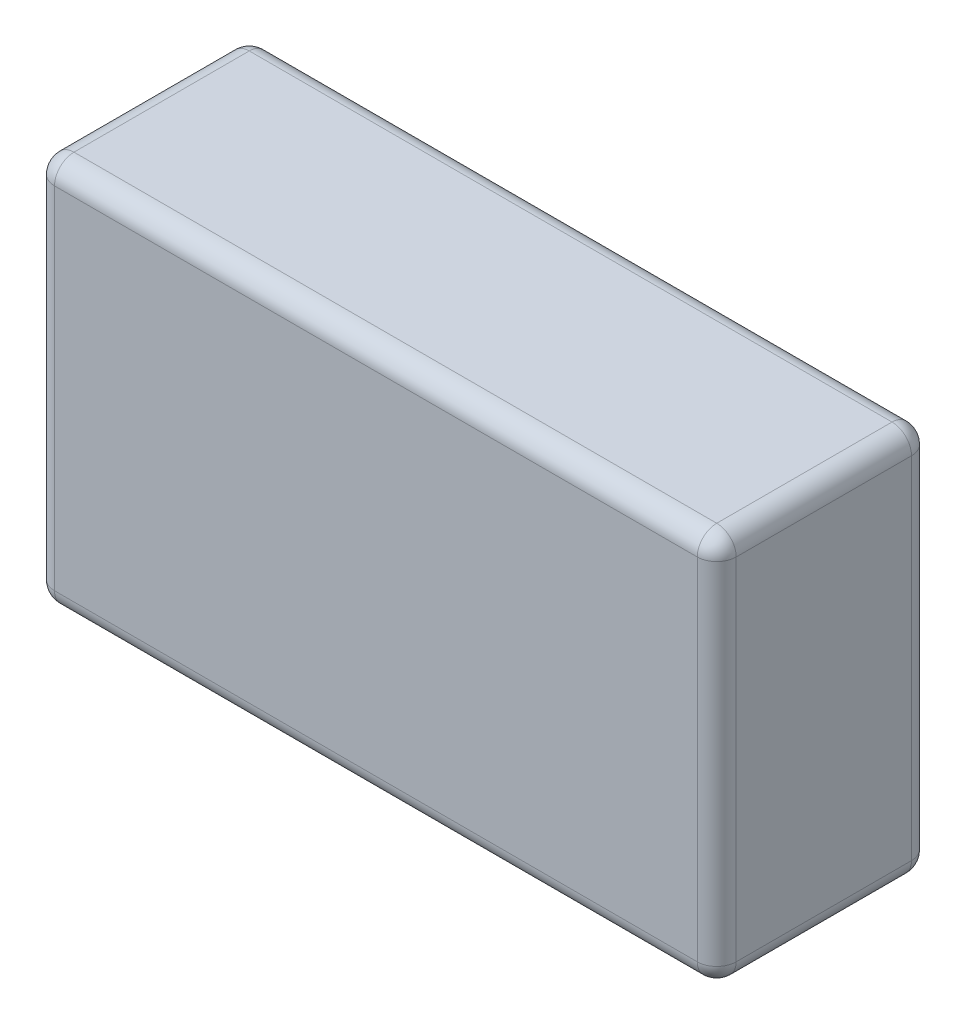
ISO-10303-21;
HEADER;
FILE_DESCRIPTION(('STEP AP214'),'2;1');
FILE_NAME('part.step','',(''),(''),'','','');
FILE_SCHEMA(('AUTOMOTIVE_DESIGN { 1 0 10303 214 1 1 1 1 }'));
ENDSEC;
DATA;
#1=APPLICATION_CONTEXT('core data for automotive mechanical design processes');
#2=APPLICATION_PROTOCOL_DEFINITION('international standard','automotive_design',2000,#1);
#3=PRODUCT_CONTEXT('',#1,'mechanical');
#4=PRODUCT('Part','Part','',(#3));
#5=PRODUCT_RELATED_PRODUCT_CATEGORY('part','',(#4));
#6=PRODUCT_DEFINITION_FORMATION('','',#4);
#7=PRODUCT_DEFINITION_CONTEXT('part definition',#1,'design');
#8=PRODUCT_DEFINITION('design','',#6,#7);
#9=PRODUCT_DEFINITION_SHAPE('','',#8);
#10=(LENGTH_UNIT() NAMED_UNIT(*) SI_UNIT(.MILLI.,.METRE.));
#11=(NAMED_UNIT(*) PLANE_ANGLE_UNIT() SI_UNIT($,.RADIAN.));
#12=(NAMED_UNIT(*) SI_UNIT($,.STERADIAN.) SOLID_ANGLE_UNIT());
#13=UNCERTAINTY_MEASURE_WITH_UNIT(LENGTH_MEASURE(1.E-05),#10,'distance_accuracy_value','');
#14=(GEOMETRIC_REPRESENTATION_CONTEXT(3) GLOBAL_UNCERTAINTY_ASSIGNED_CONTEXT((#13)) GLOBAL_UNIT_ASSIGNED_CONTEXT((#10,
#11,#12)) REPRESENTATION_CONTEXT('',''));
#15=CARTESIAN_POINT('',(0.,0.,0.));
#16=DIRECTION('',(0.,0.,1.));
#17=DIRECTION('',(1.,0.,0.));
#18=AXIS2_PLACEMENT_3D('',#15,#16,#17);
#19=CARTESIAN_POINT('',(35.,-20.,11.));
#20=DIRECTION('',(-1.,0.,0.));
#21=DIRECTION('',(0.,0.,1.));
#22=AXIS2_PLACEMENT_3D('',#19,#20,#21);
#23=PLANE('',#22);
#24=DIRECTION('',(0.,1.,0.));
#25=VECTOR('',#24,1.);
#26=CARTESIAN_POINT('',(35.,-20.,9.));
#27=LINE('',#26,#25);
#28=CARTESIAN_POINT('',(35.,18.,9.));
#29=VERTEX_POINT('',#28);
#30=CARTESIAN_POINT('',(35.,-18.,9.));
#31=VERTEX_POINT('',#30);
#32=EDGE_CURVE('E166',#29,#31,#27,.F.);
#33=ORIENTED_EDGE('',*,*,#32,.T.);
#34=DIRECTION('',(0.,0.,-1.));
#35=VECTOR('',#34,1.);
#36=CARTESIAN_POINT('',(35.,-18.,11.));
#37=LINE('',#36,#35);
#38=CARTESIAN_POINT('',(35.,-18.,-9.));
#39=VERTEX_POINT('',#38);
#40=EDGE_CURVE('E171',#31,#39,#37,.T.);
#41=ORIENTED_EDGE('',*,*,#40,.T.);
#42=DIRECTION('',(0.,1.,0.));
#43=VECTOR('',#42,1.);
#44=CARTESIAN_POINT('',(35.,20.,-9.));
#45=LINE('',#44,#43);
#46=CARTESIAN_POINT('',(35.,18.,-9.));
#47=VERTEX_POINT('',#46);
#48=EDGE_CURVE('E143',#39,#47,#45,.T.);
#49=ORIENTED_EDGE('',*,*,#48,.T.);
#50=DIRECTION('',(0.,0.,-1.));
#51=VECTOR('',#50,1.);
#52=CARTESIAN_POINT('',(35.,18.,11.));
#53=LINE('',#52,#51);
#54=EDGE_CURVE('E161',#47,#29,#53,.F.);
#55=ORIENTED_EDGE('',*,*,#54,.T.);
#56=EDGE_LOOP('',(#33,#41,#49,#55));
#57=FACE_BOUND('',#56,.T.);
#58=ADVANCED_FACE('F50',(#57),#23,.F.);
#59=CARTESIAN_POINT('',(-35.,20.,11.));
#60=DIRECTION('',(0.,-1.,0.));
#61=DIRECTION('',(0.,0.,-1.));
#62=AXIS2_PLACEMENT_3D('',#59,#60,#61);
#63=PLANE('',#62);
#64=DIRECTION('',(-1.,0.,0.));
#65=VECTOR('',#64,1.);
#66=CARTESIAN_POINT('',(-35.,20.,-9.));
#67=LINE('',#66,#65);
#68=CARTESIAN_POINT('',(33.,20.,-9.));
#69=VERTEX_POINT('',#68);
#70=CARTESIAN_POINT('',(-33.,20.,-9.));
#71=VERTEX_POINT('',#70);
#72=EDGE_CURVE('E189',#69,#71,#67,.T.);
#73=ORIENTED_EDGE('',*,*,#72,.T.);
#74=DIRECTION('',(0.,0.,-1.));
#75=VECTOR('',#74,1.);
#76=CARTESIAN_POINT('',(-33.,20.,11.));
#77=LINE('',#76,#75);
#78=CARTESIAN_POINT('',(-33.,20.,9.));
#79=VERTEX_POINT('',#78);
#80=EDGE_CURVE('E192',#71,#79,#77,.F.);
#81=ORIENTED_EDGE('',*,*,#80,.T.);
#82=DIRECTION('',(-1.,0.,0.));
#83=VECTOR('',#82,1.);
#84=CARTESIAN_POINT('',(-35.,20.,9.));
#85=LINE('',#84,#83);
#86=CARTESIAN_POINT('',(33.,20.,9.));
#87=VERTEX_POINT('',#86);
#88=EDGE_CURVE('E187',#79,#87,#85,.F.);
#89=ORIENTED_EDGE('',*,*,#88,.T.);
#90=DIRECTION('',(0.,0.,-1.));
#91=VECTOR('',#90,1.);
#92=CARTESIAN_POINT('',(33.,20.,11.));
#93=LINE('',#92,#91);
#94=EDGE_CURVE('E183',#87,#69,#93,.T.);
#95=ORIENTED_EDGE('',*,*,#94,.T.);
#96=EDGE_LOOP('',(#73,#81,#89,#95));
#97=FACE_BOUND('',#96,.T.);
#98=ADVANCED_FACE('F336',(#97),#63,.F.);
#99=CARTESIAN_POINT('',(-35.,-20.,11.));
#100=DIRECTION('',(1.,0.,0.));
#101=DIRECTION('',(0.,0.,-1.));
#102=AXIS2_PLACEMENT_3D('',#99,#100,#101);
#103=PLANE('',#102);
#104=DIRECTION('',(0.,-1.,0.));
#105=VECTOR('',#104,1.);
#106=CARTESIAN_POINT('',(-35.,-20.,-9.));
#107=LINE('',#106,#105);
#108=CARTESIAN_POINT('',(-35.,18.,-9.));
#109=VERTEX_POINT('',#108);
#110=CARTESIAN_POINT('',(-35.,-18.,-9.));
#111=VERTEX_POINT('',#110);
#112=EDGE_CURVE('E199',#109,#111,#107,.T.);
#113=ORIENTED_EDGE('',*,*,#112,.T.);
#114=DIRECTION('',(0.,0.,-1.));
#115=VECTOR('',#114,1.);
#116=CARTESIAN_POINT('',(-35.,-18.,11.));
#117=LINE('',#116,#115);
#118=CARTESIAN_POINT('',(-35.,-18.,9.));
#119=VERTEX_POINT('',#118);
#120=EDGE_CURVE('E196',#111,#119,#117,.F.);
#121=ORIENTED_EDGE('',*,*,#120,.T.);
#122=DIRECTION('',(0.,-1.,0.));
#123=VECTOR('',#122,1.);
#124=CARTESIAN_POINT('',(-35.,-20.,9.));
#125=LINE('',#124,#123);
#126=CARTESIAN_POINT('',(-35.,18.,9.));
#127=VERTEX_POINT('',#126);
#128=EDGE_CURVE('E193',#119,#127,#125,.F.);
#129=ORIENTED_EDGE('',*,*,#128,.T.);
#130=DIRECTION('',(0.,0.,-1.));
#131=VECTOR('',#130,1.);
#132=CARTESIAN_POINT('',(-35.,18.,11.));
#133=LINE('',#132,#131);
#134=EDGE_CURVE('E194',#127,#109,#133,.T.);
#135=ORIENTED_EDGE('',*,*,#134,.T.);
#136=EDGE_LOOP('',(#113,#121,#129,#135));
#137=FACE_BOUND('',#136,.T.);
#138=ADVANCED_FACE('F308',(#137),#103,.F.);
#139=CARTESIAN_POINT('',(-35.,-20.,11.));
#140=DIRECTION('',(0.,1.,0.));
#141=DIRECTION('',(0.,0.,1.));
#142=AXIS2_PLACEMENT_3D('',#139,#140,#141);
#143=PLANE('',#142);
#144=DIRECTION('',(1.,0.,0.));
#145=VECTOR('',#144,1.);
#146=CARTESIAN_POINT('',(35.,-20.,-9.));
#147=LINE('',#146,#145);
#148=CARTESIAN_POINT('',(-33.,-20.,-9.));
#149=VERTEX_POINT('',#148);
#150=CARTESIAN_POINT('',(33.,-20.,-9.));
#151=VERTEX_POINT('',#150);
#152=EDGE_CURVE('E207',#149,#151,#147,.T.);
#153=ORIENTED_EDGE('',*,*,#152,.T.);
#154=DIRECTION('',(0.,0.,-1.));
#155=VECTOR('',#154,1.);
#156=CARTESIAN_POINT('',(33.,-20.,11.));
#157=LINE('',#156,#155);
#158=CARTESIAN_POINT('',(33.,-20.,9.));
#159=VERTEX_POINT('',#158);
#160=EDGE_CURVE('E209',#151,#159,#157,.F.);
#161=ORIENTED_EDGE('',*,*,#160,.T.);
#162=DIRECTION('',(1.,0.,0.));
#163=VECTOR('',#162,1.);
#164=CARTESIAN_POINT('',(-35.,-20.,9.));
#165=LINE('',#164,#163);
#166=CARTESIAN_POINT('',(-33.,-20.,9.));
#167=VERTEX_POINT('',#166);
#168=EDGE_CURVE('E203',#159,#167,#165,.F.);
#169=ORIENTED_EDGE('',*,*,#168,.T.);
#170=DIRECTION('',(0.,0.,-1.));
#171=VECTOR('',#170,1.);
#172=CARTESIAN_POINT('',(-33.,-20.,11.));
#173=LINE('',#172,#171);
#174=EDGE_CURVE('E205',#167,#149,#173,.T.);
#175=ORIENTED_EDGE('',*,*,#174,.T.);
#176=EDGE_LOOP('',(#153,#161,#169,#175));
#177=FACE_BOUND('',#176,.T.);
#178=ADVANCED_FACE('F285',(#177),#143,.F.);
#179=CARTESIAN_POINT('',(0.,0.,11.));
#180=DIRECTION('',(0.,0.,-1.));
#181=DIRECTION('',(-1.,0.,0.));
#182=AXIS2_PLACEMENT_3D('',#179,#180,#181);
#183=PLANE('',#182);
#184=DIRECTION('',(1.,0.,0.));
#185=VECTOR('',#184,1.);
#186=CARTESIAN_POINT('',(0.,-18.,11.));
#187=LINE('',#186,#185);
#188=CARTESIAN_POINT('',(-33.,-18.,11.));
#189=VERTEX_POINT('',#188);
#190=CARTESIAN_POINT('',(33.,-18.,11.));
#191=VERTEX_POINT('',#190);
#192=EDGE_CURVE('E212',#189,#191,#187,.T.);
#193=ORIENTED_EDGE('',*,*,#192,.T.);
#194=DIRECTION('',(0.,1.,0.));
#195=VECTOR('',#194,1.);
#196=CARTESIAN_POINT('',(33.,0.,11.));
#197=LINE('',#196,#195);
#198=CARTESIAN_POINT('',(33.,18.,11.));
#199=VERTEX_POINT('',#198);
#200=EDGE_CURVE('E11',#191,#199,#197,.T.);
#201=ORIENTED_EDGE('',*,*,#200,.T.);
#202=DIRECTION('',(-1.,0.,0.));
#203=VECTOR('',#202,1.);
#204=CARTESIAN_POINT('',(0.,18.,11.));
#205=LINE('',#204,#203);
#206=CARTESIAN_POINT('',(-33.,18.,11.));
#207=VERTEX_POINT('',#206);
#208=EDGE_CURVE('E60',#199,#207,#205,.T.);
#209=ORIENTED_EDGE('',*,*,#208,.T.);
#210=DIRECTION('',(0.,-1.,0.));
#211=VECTOR('',#210,1.);
#212=CARTESIAN_POINT('',(-33.,0.,11.));
#213=LINE('',#212,#211);
#214=EDGE_CURVE('E214',#207,#189,#213,.T.);
#215=ORIENTED_EDGE('',*,*,#214,.T.);
#216=EDGE_LOOP('',(#193,#201,#209,#215));
#217=FACE_BOUND('',#216,.T.);
#218=ADVANCED_FACE('F292',(#217),#183,.F.);
#219=CARTESIAN_POINT('',(0.,0.,-11.));
#220=DIRECTION('',(0.,0.,-1.));
#221=DIRECTION('',(-1.,0.,0.));
#222=AXIS2_PLACEMENT_3D('',#219,#220,#221);
#223=PLANE('',#222);
#224=DIRECTION('',(-1.,0.,0.));
#225=VECTOR('',#224,1.);
#226=CARTESIAN_POINT('',(35.,18.,-11.));
#227=LINE('',#226,#225);
#228=CARTESIAN_POINT('',(-33.,18.,-11.));
#229=VERTEX_POINT('',#228);
#230=CARTESIAN_POINT('',(33.,18.,-11.));
#231=VERTEX_POINT('',#230);
#232=EDGE_CURVE('E181',#229,#231,#227,.F.);
#233=ORIENTED_EDGE('',*,*,#232,.T.);
#234=DIRECTION('',(0.,1.,0.));
#235=VECTOR('',#234,1.);
#236=CARTESIAN_POINT('',(33.,-20.,-11.));
#237=LINE('',#236,#235);
#238=CARTESIAN_POINT('',(33.,-18.,-11.));
#239=VERTEX_POINT('',#238);
#240=EDGE_CURVE('E150',#231,#239,#237,.F.);
#241=ORIENTED_EDGE('',*,*,#240,.T.);
#242=DIRECTION('',(1.,0.,0.));
#243=VECTOR('',#242,1.);
#244=CARTESIAN_POINT('',(-35.,-18.,-11.));
#245=LINE('',#244,#243);
#246=CARTESIAN_POINT('',(-33.,-18.,-11.));
#247=VERTEX_POINT('',#246);
#248=EDGE_CURVE('E172',#239,#247,#245,.F.);
#249=ORIENTED_EDGE('',*,*,#248,.T.);
#250=DIRECTION('',(0.,-1.,0.));
#251=VECTOR('',#250,1.);
#252=CARTESIAN_POINT('',(-33.,20.,-11.));
#253=LINE('',#252,#251);
#254=EDGE_CURVE('E177',#247,#229,#253,.F.);
#255=ORIENTED_EDGE('',*,*,#254,.T.);
#256=EDGE_LOOP('',(#233,#241,#249,#255));
#257=FACE_BOUND('',#256,.T.);
#258=ADVANCED_FACE('F391',(#257),#223,.T.);
#259=CARTESIAN_POINT('',(-33.,0.,9.));
#260=DIRECTION('',(0.,-1.,0.));
#261=DIRECTION('',(0.,0.,-1.));
#262=AXIS2_PLACEMENT_3D('',#259,#260,#261);
#263=CYLINDRICAL_SURFACE('',#262,2.);
#264=CARTESIAN_POINT('',(-33.,-18.,9.));
#265=DIRECTION('',(0.,-1.,0.));
#266=DIRECTION('',(0.,0.,-1.));
#267=AXIS2_PLACEMENT_3D('',#264,#265,#266);
#268=CIRCLE('',#267,2.);
#269=EDGE_CURVE('E55',#189,#119,#268,.T.);
#270=ORIENTED_EDGE('',*,*,#269,.F.);
#271=ORIENTED_EDGE('',*,*,#214,.F.);
#272=CARTESIAN_POINT('',(-33.,18.,9.));
#273=DIRECTION('',(0.,1.,0.));
#274=DIRECTION('',(0.,0.,1.));
#275=AXIS2_PLACEMENT_3D('',#272,#273,#274);
#276=CIRCLE('',#275,2.);
#277=EDGE_CURVE('E264',#127,#207,#276,.T.);
#278=ORIENTED_EDGE('',*,*,#277,.F.);
#279=ORIENTED_EDGE('',*,*,#128,.F.);
#280=EDGE_LOOP('',(#270,#271,#278,#279));
#281=FACE_BOUND('',#280,.T.);
#282=ADVANCED_FACE('F49',(#281),#263,.T.);
#283=CARTESIAN_POINT('',(-33.,-18.,9.));
#284=DIRECTION('',(-1.,0.,0.));
#285=DIRECTION('',(0.,0.,1.));
#286=AXIS2_PLACEMENT_3D('',#283,#284,#285);
#287=SPHERICAL_SURFACE('',#286,2.);
#288=CARTESIAN_POINT('',(-33.,-18.,9.));
#289=DIRECTION('',(-1.,0.,0.));
#290=DIRECTION('',(0.,0.,1.));
#291=AXIS2_PLACEMENT_3D('',#288,#289,#290);
#292=CIRCLE('',#291,2.);
#293=EDGE_CURVE('E260',#189,#167,#292,.F.);
#294=ORIENTED_EDGE('',*,*,#293,.F.);
#295=ORIENTED_EDGE('',*,*,#269,.T.);
#296=CARTESIAN_POINT('',(-33.,-18.,9.));
#297=DIRECTION('',(0.,0.,1.));
#298=DIRECTION('',(1.,0.,0.));
#299=AXIS2_PLACEMENT_3D('',#296,#297,#298);
#300=CIRCLE('',#299,2.);
#301=EDGE_CURVE('E258',#167,#119,#300,.F.);
#302=ORIENTED_EDGE('',*,*,#301,.F.);
#303=EDGE_LOOP('',(#294,#295,#302));
#304=FACE_BOUND('',#303,.T.);
#305=ADVANCED_FACE('F271',(#304),#287,.T.);
#306=CARTESIAN_POINT('',(-33.,18.,9.));
#307=DIRECTION('',(0.,0.,1.));
#308=DIRECTION('',(1.,0.,0.));
#309=AXIS2_PLACEMENT_3D('',#306,#307,#308);
#310=SPHERICAL_SURFACE('',#309,2.);
#311=CARTESIAN_POINT('',(-33.,18.,9.));
#312=DIRECTION('',(0.,0.,1.));
#313=DIRECTION('',(1.,0.,0.));
#314=AXIS2_PLACEMENT_3D('',#311,#312,#313);
#315=CIRCLE('',#314,2.);
#316=EDGE_CURVE('E252',#127,#79,#315,.F.);
#317=ORIENTED_EDGE('',*,*,#316,.F.);
#318=ORIENTED_EDGE('',*,*,#277,.T.);
#319=CARTESIAN_POINT('',(-33.,18.,9.));
#320=DIRECTION('',(-1.,0.,0.));
#321=DIRECTION('',(0.,0.,1.));
#322=AXIS2_PLACEMENT_3D('',#319,#320,#321);
#323=CIRCLE('',#322,2.);
#324=EDGE_CURVE('E251',#79,#207,#323,.F.);
#325=ORIENTED_EDGE('',*,*,#324,.F.);
#326=EDGE_LOOP('',(#317,#318,#325));
#327=FACE_BOUND('',#326,.T.);
#328=ADVANCED_FACE('F297',(#327),#310,.T.);
#329=CARTESIAN_POINT('',(-33.,-18.,11.));
#330=DIRECTION('',(0.,0.,-1.));
#331=DIRECTION('',(-1.,0.,0.));
#332=AXIS2_PLACEMENT_3D('',#329,#330,#331);
#333=CYLINDRICAL_SURFACE('',#332,2.);
#334=ORIENTED_EDGE('',*,*,#301,.T.);
#335=ORIENTED_EDGE('',*,*,#120,.F.);
#336=CARTESIAN_POINT('',(-33.,-18.,-9.));
#337=DIRECTION('',(0.,0.,-1.));
#338=DIRECTION('',(-1.,0.,0.));
#339=AXIS2_PLACEMENT_3D('',#336,#337,#338);
#340=CIRCLE('',#339,2.);
#341=EDGE_CURVE('E246',#149,#111,#340,.T.);
#342=ORIENTED_EDGE('',*,*,#341,.F.);
#343=ORIENTED_EDGE('',*,*,#174,.F.);
#344=EDGE_LOOP('',(#334,#335,#342,#343));
#345=FACE_BOUND('',#344,.T.);
#346=ADVANCED_FACE('F278',(#345),#333,.T.);
#347=CARTESIAN_POINT('',(0.,-18.,9.));
#348=DIRECTION('',(1.,0.,0.));
#349=DIRECTION('',(0.,0.,-1.));
#350=AXIS2_PLACEMENT_3D('',#347,#348,#349);
#351=CYLINDRICAL_SURFACE('',#350,2.);
#352=ORIENTED_EDGE('',*,*,#293,.T.);
#353=ORIENTED_EDGE('',*,*,#168,.F.);
#354=CARTESIAN_POINT('',(33.,-18.,9.));
#355=DIRECTION('',(1.,0.,0.));
#356=DIRECTION('',(0.,0.,-1.));
#357=AXIS2_PLACEMENT_3D('',#354,#355,#356);
#358=CIRCLE('',#357,2.);
#359=EDGE_CURVE('E243',#191,#159,#358,.T.);
#360=ORIENTED_EDGE('',*,*,#359,.F.);
#361=ORIENTED_EDGE('',*,*,#192,.F.);
#362=EDGE_LOOP('',(#352,#353,#360,#361));
#363=FACE_BOUND('',#362,.T.);
#364=ADVANCED_FACE('F289',(#363),#351,.T.);
#365=CARTESIAN_POINT('',(33.,0.,9.));
#366=DIRECTION('',(0.,1.,0.));
#367=DIRECTION('',(0.,0.,1.));
#368=AXIS2_PLACEMENT_3D('',#365,#366,#367);
#369=CYLINDRICAL_SURFACE('',#368,2.);
#370=CARTESIAN_POINT('',(33.,18.,9.));
#371=DIRECTION('',(0.,1.,0.));
#372=DIRECTION('',(0.,0.,1.));
#373=AXIS2_PLACEMENT_3D('',#370,#371,#372);
#374=CIRCLE('',#373,2.);
#375=EDGE_CURVE('E238',#199,#29,#374,.T.);
#376=ORIENTED_EDGE('',*,*,#375,.F.);
#377=ORIENTED_EDGE('',*,*,#200,.F.);
#378=CARTESIAN_POINT('',(33.,-18.,9.));
#379=DIRECTION('',(0.,-1.,0.));
#380=DIRECTION('',(0.,0.,-1.));
#381=AXIS2_PLACEMENT_3D('',#378,#379,#380);
#382=CIRCLE('',#381,2.);
#383=EDGE_CURVE('E239',#31,#191,#382,.T.);
#384=ORIENTED_EDGE('',*,*,#383,.F.);
#385=ORIENTED_EDGE('',*,*,#32,.F.);
#386=EDGE_LOOP('',(#376,#377,#384,#385));
#387=FACE_BOUND('',#386,.T.);
#388=ADVANCED_FACE('F294',(#387),#369,.T.);
#389=CARTESIAN_POINT('',(0.,18.,9.));
#390=DIRECTION('',(-1.,0.,0.));
#391=DIRECTION('',(0.,0.,1.));
#392=AXIS2_PLACEMENT_3D('',#389,#390,#391);
#393=CYLINDRICAL_SURFACE('',#392,2.);
#394=ORIENTED_EDGE('',*,*,#324,.T.);
#395=ORIENTED_EDGE('',*,*,#208,.F.);
#396=CARTESIAN_POINT('',(33.,18.,9.));
#397=DIRECTION('',(1.,0.,0.));
#398=DIRECTION('',(0.,0.,-1.));
#399=AXIS2_PLACEMENT_3D('',#396,#397,#398);
#400=CIRCLE('',#399,2.);
#401=EDGE_CURVE('E63',#87,#199,#400,.T.);
#402=ORIENTED_EDGE('',*,*,#401,.F.);
#403=ORIENTED_EDGE('',*,*,#88,.F.);
#404=EDGE_LOOP('',(#394,#395,#402,#403));
#405=FACE_BOUND('',#404,.T.);
#406=ADVANCED_FACE('F296',(#405),#393,.T.);
#407=CARTESIAN_POINT('',(-33.,18.,11.));
#408=DIRECTION('',(0.,0.,-1.));
#409=DIRECTION('',(-1.,0.,0.));
#410=AXIS2_PLACEMENT_3D('',#407,#408,#409);
#411=CYLINDRICAL_SURFACE('',#410,2.);
#412=ORIENTED_EDGE('',*,*,#316,.T.);
#413=ORIENTED_EDGE('',*,*,#80,.F.);
#414=CARTESIAN_POINT('',(-33.,18.,-9.));
#415=DIRECTION('',(0.,0.,-1.));
#416=DIRECTION('',(-1.,0.,0.));
#417=AXIS2_PLACEMENT_3D('',#414,#415,#416);
#418=CIRCLE('',#417,2.);
#419=EDGE_CURVE('E234',#109,#71,#418,.T.);
#420=ORIENTED_EDGE('',*,*,#419,.F.);
#421=ORIENTED_EDGE('',*,*,#134,.F.);
#422=EDGE_LOOP('',(#412,#413,#420,#421));
#423=FACE_BOUND('',#422,.T.);
#424=ADVANCED_FACE('F304',(#423),#411,.T.);
#425=CARTESIAN_POINT('',(-33.,-20.,-9.));
#426=DIRECTION('',(0.,1.,0.));
#427=DIRECTION('',(0.,0.,1.));
#428=AXIS2_PLACEMENT_3D('',#425,#426,#427);
#429=CYLINDRICAL_SURFACE('',#428,2.);
#430=CARTESIAN_POINT('',(-33.,-18.,-9.));
#431=DIRECTION('',(0.,-1.,0.));
#432=DIRECTION('',(0.,0.,-1.));
#433=AXIS2_PLACEMENT_3D('',#430,#431,#432);
#434=CIRCLE('',#433,2.);
#435=EDGE_CURVE('E247',#111,#247,#434,.T.);
#436=ORIENTED_EDGE('',*,*,#435,.F.);
#437=ORIENTED_EDGE('',*,*,#112,.F.);
#438=CARTESIAN_POINT('',(-33.,18.,-9.));
#439=DIRECTION('',(0.,1.,0.));
#440=DIRECTION('',(-1.,0.,0.));
#441=AXIS2_PLACEMENT_3D('',#438,#439,#440);
#442=CIRCLE('',#441,2.);
#443=EDGE_CURVE('E233',#229,#109,#442,.T.);
#444=ORIENTED_EDGE('',*,*,#443,.F.);
#445=ORIENTED_EDGE('',*,*,#254,.F.);
#446=EDGE_LOOP('',(#436,#437,#444,#445));
#447=FACE_BOUND('',#446,.T.);
#448=ADVANCED_FACE('F315',(#447),#429,.T.);
#449=CARTESIAN_POINT('',(-33.,-18.,-9.));
#450=DIRECTION('',(-1.,0.,0.));
#451=DIRECTION('',(0.,0.,1.));
#452=AXIS2_PLACEMENT_3D('',#449,#450,#451);
#453=SPHERICAL_SURFACE('',#452,2.);
#454=ORIENTED_EDGE('',*,*,#341,.T.);
#455=ORIENTED_EDGE('',*,*,#435,.T.);
#456=CARTESIAN_POINT('',(-33.,-18.,-9.));
#457=DIRECTION('',(-1.,0.,0.));
#458=DIRECTION('',(0.,0.,1.));
#459=AXIS2_PLACEMENT_3D('',#456,#457,#458);
#460=CIRCLE('',#459,2.);
#461=EDGE_CURVE('E226',#149,#247,#460,.F.);
#462=ORIENTED_EDGE('',*,*,#461,.F.);
#463=EDGE_LOOP('',(#454,#455,#462));
#464=FACE_BOUND('',#463,.T.);
#465=ADVANCED_FACE('F317',(#464),#453,.T.);
#466=CARTESIAN_POINT('',(33.,-18.,9.));
#467=DIRECTION('',(0.,0.,1.));
#468=DIRECTION('',(1.,0.,0.));
#469=AXIS2_PLACEMENT_3D('',#466,#467,#468);
#470=SPHERICAL_SURFACE('',#469,2.);
#471=ORIENTED_EDGE('',*,*,#383,.T.);
#472=ORIENTED_EDGE('',*,*,#359,.T.);
#473=CARTESIAN_POINT('',(33.,-18.,9.));
#474=DIRECTION('',(0.,0.,1.));
#475=DIRECTION('',(1.,0.,0.));
#476=AXIS2_PLACEMENT_3D('',#473,#474,#475);
#477=CIRCLE('',#476,2.);
#478=EDGE_CURVE('E224',#31,#159,#477,.F.);
#479=ORIENTED_EDGE('',*,*,#478,.F.);
#480=EDGE_LOOP('',(#471,#472,#479));
#481=FACE_BOUND('',#480,.T.);
#482=ADVANCED_FACE('F328',(#481),#470,.T.);
#483=CARTESIAN_POINT('',(33.,18.,9.));
#484=DIRECTION('',(0.,0.,1.));
#485=DIRECTION('',(1.,0.,0.));
#486=AXIS2_PLACEMENT_3D('',#483,#484,#485);
#487=SPHERICAL_SURFACE('',#486,2.);
#488=ORIENTED_EDGE('',*,*,#401,.T.);
#489=ORIENTED_EDGE('',*,*,#375,.T.);
#490=CARTESIAN_POINT('',(33.,18.,9.));
#491=DIRECTION('',(0.,0.,1.));
#492=DIRECTION('',(1.,0.,0.));
#493=AXIS2_PLACEMENT_3D('',#490,#491,#492);
#494=CIRCLE('',#493,2.);
#495=EDGE_CURVE('E164',#87,#29,#494,.F.);
#496=ORIENTED_EDGE('',*,*,#495,.F.);
#497=EDGE_LOOP('',(#488,#489,#496));
#498=FACE_BOUND('',#497,.T.);
#499=ADVANCED_FACE('F327',(#498),#487,.T.);
#500=CARTESIAN_POINT('',(-33.,18.,-9.));
#501=DIRECTION('',(-1.,0.,0.));
#502=DIRECTION('',(0.,-1.,0.));
#503=AXIS2_PLACEMENT_3D('',#500,#501,#502);
#504=SPHERICAL_SURFACE('',#503,2.);
#505=ORIENTED_EDGE('',*,*,#443,.T.);
#506=ORIENTED_EDGE('',*,*,#419,.T.);
#507=CARTESIAN_POINT('',(-33.,18.,-9.));
#508=DIRECTION('',(-1.,0.,0.));
#509=DIRECTION('',(0.,0.,1.));
#510=AXIS2_PLACEMENT_3D('',#507,#508,#509);
#511=CIRCLE('',#510,2.);
#512=EDGE_CURVE('E225',#229,#71,#511,.F.);
#513=ORIENTED_EDGE('',*,*,#512,.F.);
#514=EDGE_LOOP('',(#505,#506,#513));
#515=FACE_BOUND('',#514,.T.);
#516=ADVANCED_FACE('F332',(#515),#504,.T.);
#517=CARTESIAN_POINT('',(-35.,-18.,-9.));
#518=DIRECTION('',(-1.,0.,0.));
#519=DIRECTION('',(0.,0.,1.));
#520=AXIS2_PLACEMENT_3D('',#517,#518,#519);
#521=CYLINDRICAL_SURFACE('',#520,2.);
#522=ORIENTED_EDGE('',*,*,#461,.T.);
#523=ORIENTED_EDGE('',*,*,#248,.F.);
#524=CARTESIAN_POINT('',(33.,-18.,-9.));
#525=DIRECTION('',(1.,0.,0.));
#526=DIRECTION('',(0.,0.,-1.));
#527=AXIS2_PLACEMENT_3D('',#524,#525,#526);
#528=CIRCLE('',#527,2.);
#529=EDGE_CURVE('E220',#151,#239,#528,.T.);
#530=ORIENTED_EDGE('',*,*,#529,.F.);
#531=ORIENTED_EDGE('',*,*,#152,.F.);
#532=EDGE_LOOP('',(#522,#523,#530,#531));
#533=FACE_BOUND('',#532,.T.);
#534=ADVANCED_FACE('F316',(#533),#521,.T.);
#535=CARTESIAN_POINT('',(33.,-18.,11.));
#536=DIRECTION('',(0.,0.,-1.));
#537=DIRECTION('',(-1.,0.,0.));
#538=AXIS2_PLACEMENT_3D('',#535,#536,#537);
#539=CYLINDRICAL_SURFACE('',#538,2.);
#540=ORIENTED_EDGE('',*,*,#478,.T.);
#541=ORIENTED_EDGE('',*,*,#160,.F.);
#542=CARTESIAN_POINT('',(33.,-18.,-9.));
#543=DIRECTION('',(0.,0.,-1.));
#544=DIRECTION('',(-1.,0.,0.));
#545=AXIS2_PLACEMENT_3D('',#542,#543,#544);
#546=CIRCLE('',#545,2.);
#547=EDGE_CURVE('E159',#39,#151,#546,.T.);
#548=ORIENTED_EDGE('',*,*,#547,.F.);
#549=ORIENTED_EDGE('',*,*,#40,.F.);
#550=EDGE_LOOP('',(#540,#541,#548,#549));
#551=FACE_BOUND('',#550,.T.);
#552=ADVANCED_FACE('F321',(#551),#539,.T.);
#553=CARTESIAN_POINT('',(33.,18.,11.));
#554=DIRECTION('',(0.,0.,-1.));
#555=DIRECTION('',(-1.,0.,0.));
#556=AXIS2_PLACEMENT_3D('',#553,#554,#555);
#557=CYLINDRICAL_SURFACE('',#556,2.);
#558=ORIENTED_EDGE('',*,*,#495,.T.);
#559=ORIENTED_EDGE('',*,*,#54,.F.);
#560=CARTESIAN_POINT('',(33.,18.,-9.));
#561=DIRECTION('',(0.,0.,-1.));
#562=DIRECTION('',(-1.,0.,0.));
#563=AXIS2_PLACEMENT_3D('',#560,#561,#562);
#564=CIRCLE('',#563,2.);
#565=EDGE_CURVE('E152',#69,#47,#564,.T.);
#566=ORIENTED_EDGE('',*,*,#565,.F.);
#567=ORIENTED_EDGE('',*,*,#94,.F.);
#568=EDGE_LOOP('',(#558,#559,#566,#567));
#569=FACE_BOUND('',#568,.T.);
#570=ADVANCED_FACE('F165',(#569),#557,.T.);
#571=CARTESIAN_POINT('',(-35.,18.,-9.));
#572=DIRECTION('',(1.,0.,0.));
#573=DIRECTION('',(0.,0.,-1.));
#574=AXIS2_PLACEMENT_3D('',#571,#572,#573);
#575=CYLINDRICAL_SURFACE('',#574,2.);
#576=ORIENTED_EDGE('',*,*,#512,.T.);
#577=ORIENTED_EDGE('',*,*,#72,.F.);
#578=CARTESIAN_POINT('',(33.,18.,-9.));
#579=DIRECTION('',(1.,0.,0.));
#580=DIRECTION('',(0.,0.,-1.));
#581=AXIS2_PLACEMENT_3D('',#578,#579,#580);
#582=CIRCLE('',#581,2.);
#583=EDGE_CURVE('E160',#231,#69,#582,.T.);
#584=ORIENTED_EDGE('',*,*,#583,.F.);
#585=ORIENTED_EDGE('',*,*,#232,.F.);
#586=EDGE_LOOP('',(#576,#577,#584,#585));
#587=FACE_BOUND('',#586,.T.);
#588=ADVANCED_FACE('F360',(#587),#575,.T.);
#589=CARTESIAN_POINT('',(33.,-18.,-9.));
#590=DIRECTION('',(0.,-1.,0.));
#591=DIRECTION('',(0.,0.,-1.));
#592=AXIS2_PLACEMENT_3D('',#589,#590,#591);
#593=SPHERICAL_SURFACE('',#592,2.);
#594=ORIENTED_EDGE('',*,*,#547,.T.);
#595=ORIENTED_EDGE('',*,*,#529,.T.);
#596=CARTESIAN_POINT('',(33.,-18.,-9.));
#597=DIRECTION('',(0.,-1.,0.));
#598=DIRECTION('',(0.,0.,-1.));
#599=AXIS2_PLACEMENT_3D('',#596,#597,#598);
#600=CIRCLE('',#599,2.);
#601=EDGE_CURVE('E148',#39,#239,#600,.F.);
#602=ORIENTED_EDGE('',*,*,#601,.F.);
#603=EDGE_LOOP('',(#594,#595,#602));
#604=FACE_BOUND('',#603,.T.);
#605=ADVANCED_FACE('F354',(#604),#593,.T.);
#606=CARTESIAN_POINT('',(33.,18.,-9.));
#607=DIRECTION('',(0.,1.,0.));
#608=DIRECTION('',(0.,0.,1.));
#609=AXIS2_PLACEMENT_3D('',#606,#607,#608);
#610=SPHERICAL_SURFACE('',#609,2.);
#611=ORIENTED_EDGE('',*,*,#583,.T.);
#612=ORIENTED_EDGE('',*,*,#565,.T.);
#613=CARTESIAN_POINT('',(33.,18.,-9.));
#614=DIRECTION('',(0.,1.,0.));
#615=DIRECTION('',(0.,0.,1.));
#616=AXIS2_PLACEMENT_3D('',#613,#614,#615);
#617=CIRCLE('',#616,2.);
#618=EDGE_CURVE('E142',#231,#47,#617,.F.);
#619=ORIENTED_EDGE('',*,*,#618,.F.);
#620=EDGE_LOOP('',(#611,#612,#619));
#621=FACE_BOUND('',#620,.T.);
#622=ADVANCED_FACE('F151',(#621),#610,.T.);
#623=CARTESIAN_POINT('',(33.,-20.,-9.));
#624=DIRECTION('',(0.,-1.,0.));
#625=DIRECTION('',(0.,0.,-1.));
#626=AXIS2_PLACEMENT_3D('',#623,#624,#625);
#627=CYLINDRICAL_SURFACE('',#626,2.);
#628=ORIENTED_EDGE('',*,*,#601,.T.);
#629=ORIENTED_EDGE('',*,*,#240,.F.);
#630=ORIENTED_EDGE('',*,*,#618,.T.);
#631=ORIENTED_EDGE('',*,*,#48,.F.);
#632=EDGE_LOOP('',(#628,#629,#630,#631));
#633=FACE_BOUND('',#632,.T.);
#634=ADVANCED_FACE('F141',(#633),#627,.T.);
#635=CLOSED_SHELL('',(#58,#98,#138,#178,#218,#258,#282,#305,#328,#346,#364,#388,#406,#424,#448,
#465,#482,#499,#516,#534,#552,#570,#588,#605,#622,#634));
#636=MANIFOLD_SOLID_BREP('B2',#635);
#637=ADVANCED_BREP_SHAPE_REPRESENTATION('',(#18,#636),#14);
#638=SHAPE_DEFINITION_REPRESENTATION(#9,#637);
ENDSEC;
END-ISO-10303-21;
